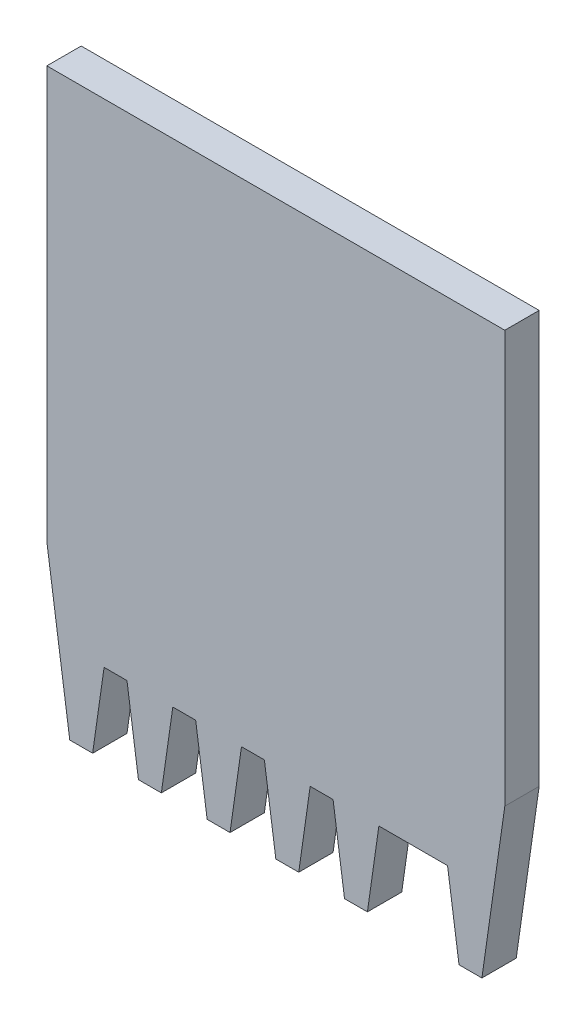
ISO-10303-21;
HEADER;
FILE_DESCRIPTION(('STEP AP214'),'2;1');
FILE_NAME('part.step','',(''),(''),'','','');
FILE_SCHEMA(('AUTOMOTIVE_DESIGN { 1 0 10303 214 1 1 1 1 }'));
ENDSEC;
DATA;
#1=APPLICATION_CONTEXT('core data for automotive mechanical design processes');
#2=APPLICATION_PROTOCOL_DEFINITION('international standard','automotive_design',2000,#1);
#3=PRODUCT_CONTEXT('',#1,'mechanical');
#4=PRODUCT('Part','Part','',(#3));
#5=PRODUCT_RELATED_PRODUCT_CATEGORY('part','',(#4));
#6=PRODUCT_DEFINITION_FORMATION('','',#4);
#7=PRODUCT_DEFINITION_CONTEXT('part definition',#1,'design');
#8=PRODUCT_DEFINITION('design','',#6,#7);
#9=PRODUCT_DEFINITION_SHAPE('','',#8);
#10=(LENGTH_UNIT() NAMED_UNIT(*) SI_UNIT(.MILLI.,.METRE.));
#11=(NAMED_UNIT(*) PLANE_ANGLE_UNIT() SI_UNIT($,.RADIAN.));
#12=(NAMED_UNIT(*) SI_UNIT($,.STERADIAN.) SOLID_ANGLE_UNIT());
#13=UNCERTAINTY_MEASURE_WITH_UNIT(LENGTH_MEASURE(1.E-05),#10,'distance_accuracy_value','');
#14=(GEOMETRIC_REPRESENTATION_CONTEXT(3) GLOBAL_UNCERTAINTY_ASSIGNED_CONTEXT((#13)) GLOBAL_UNIT_ASSIGNED_CONTEXT((#10,
#11,#12)) REPRESENTATION_CONTEXT('',''));
#15=CARTESIAN_POINT('',(0.,0.,0.));
#16=DIRECTION('',(0.,0.,1.));
#17=DIRECTION('',(1.,0.,0.));
#18=AXIS2_PLACEMENT_3D('',#15,#16,#17);
#19=CARTESIAN_POINT('',(0.,25.,1.5));
#20=DIRECTION('',(0.,-1.,0.));
#21=DIRECTION('',(1.,0.,0.));
#22=AXIS2_PLACEMENT_3D('',#19,#20,#21);
#23=PLANE('',#22);
#24=DIRECTION('',(-1.,0.,0.));
#25=VECTOR('',#24,1.);
#26=CARTESIAN_POINT('',(0.,25.,0.));
#27=LINE('',#26,#25);
#28=CARTESIAN_POINT('',(20.,25.,0.));
#29=VERTEX_POINT('',#28);
#30=CARTESIAN_POINT('',(0.,25.,0.));
#31=VERTEX_POINT('',#30);
#32=EDGE_CURVE('E239',#29,#31,#27,.T.);
#33=ORIENTED_EDGE('',*,*,#32,.T.);
#34=DIRECTION('',(0.,0.,-1.));
#35=VECTOR('',#34,1.);
#36=CARTESIAN_POINT('',(0.,25.,1.5));
#37=LINE('',#36,#35);
#38=CARTESIAN_POINT('',(0.,25.,1.5));
#39=VERTEX_POINT('',#38);
#40=EDGE_CURVE('E11',#39,#31,#37,.T.);
#41=ORIENTED_EDGE('',*,*,#40,.F.);
#42=DIRECTION('',(-1.,0.,0.));
#43=VECTOR('',#42,1.);
#44=CARTESIAN_POINT('',(0.,25.,1.5));
#45=LINE('',#44,#43);
#46=CARTESIAN_POINT('',(20.,25.,1.5));
#47=VERTEX_POINT('',#46);
#48=EDGE_CURVE('E289',#47,#39,#45,.T.);
#49=ORIENTED_EDGE('',*,*,#48,.F.);
#50=DIRECTION('',(0.,0.,-1.));
#51=VECTOR('',#50,1.);
#52=CARTESIAN_POINT('',(20.,25.,1.5));
#53=LINE('',#52,#51);
#54=EDGE_CURVE('E235',#47,#29,#53,.T.);
#55=ORIENTED_EDGE('',*,*,#54,.T.);
#56=EDGE_LOOP('',(#33,#41,#49,#55));
#57=FACE_BOUND('',#56,.T.);
#58=ADVANCED_FACE('F35',(#57),#23,.F.);
#59=CARTESIAN_POINT('',(0.,7.,1.5));
#60=DIRECTION('',(1.,0.,0.));
#61=DIRECTION('',(0.,0.,-1.));
#62=AXIS2_PLACEMENT_3D('',#59,#60,#61);
#63=PLANE('',#62);
#64=DIRECTION('',(0.,-1.,0.));
#65=VECTOR('',#64,1.);
#66=CARTESIAN_POINT('',(0.,7.,0.));
#67=LINE('',#66,#65);
#68=CARTESIAN_POINT('',(0.,7.,0.));
#69=VERTEX_POINT('',#68);
#70=EDGE_CURVE('E242',#31,#69,#67,.T.);
#71=ORIENTED_EDGE('',*,*,#70,.T.);
#72=DIRECTION('',(0.,0.,-1.));
#73=VECTOR('',#72,1.);
#74=CARTESIAN_POINT('',(0.,7.,1.5));
#75=LINE('',#74,#73);
#76=CARTESIAN_POINT('',(0.,7.,1.5));
#77=VERTEX_POINT('',#76);
#78=EDGE_CURVE('E43',#77,#69,#75,.T.);
#79=ORIENTED_EDGE('',*,*,#78,.F.);
#80=DIRECTION('',(0.,-1.,0.));
#81=VECTOR('',#80,1.);
#82=CARTESIAN_POINT('',(0.,7.,1.5));
#83=LINE('',#82,#81);
#84=EDGE_CURVE('E148',#39,#77,#83,.T.);
#85=ORIENTED_EDGE('',*,*,#84,.F.);
#86=ORIENTED_EDGE('',*,*,#40,.T.);
#87=EDGE_LOOP('',(#71,#79,#85,#86));
#88=FACE_BOUND('',#87,.T.);
#89=ADVANCED_FACE('F437',(#88),#63,.F.);
#90=CARTESIAN_POINT('',(0.,7.,1.5));
#91=DIRECTION('',(0.989949493661167,0.14142135623731,0.));
#92=DIRECTION('',(-0.14142135623731,0.989949493661167,0.));
#93=AXIS2_PLACEMENT_3D('',#90,#91,#92);
#94=PLANE('',#93);
#95=DIRECTION('',(0.14142135623731,-0.989949493661167,0.));
#96=VECTOR('',#95,1.);
#97=CARTESIAN_POINT('',(0.,7.,0.));
#98=LINE('',#97,#96);
#99=CARTESIAN_POINT('',(1.,0.,0.));
#100=VERTEX_POINT('',#99);
#101=EDGE_CURVE('E244',#69,#100,#98,.T.);
#102=ORIENTED_EDGE('',*,*,#101,.T.);
#103=DIRECTION('',(0.,0.,-1.));
#104=VECTOR('',#103,1.);
#105=CARTESIAN_POINT('',(1.,0.,1.5));
#106=LINE('',#105,#104);
#107=CARTESIAN_POINT('',(1.,0.,1.5));
#108=VERTEX_POINT('',#107);
#109=EDGE_CURVE('E350',#108,#100,#106,.T.);
#110=ORIENTED_EDGE('',*,*,#109,.F.);
#111=DIRECTION('',(0.14142135623731,-0.989949493661167,0.));
#112=VECTOR('',#111,1.);
#113=CARTESIAN_POINT('',(0.,7.,1.5));
#114=LINE('',#113,#112);
#115=EDGE_CURVE('E358',#77,#108,#114,.T.);
#116=ORIENTED_EDGE('',*,*,#115,.F.);
#117=ORIENTED_EDGE('',*,*,#78,.T.);
#118=EDGE_LOOP('',(#102,#110,#116,#117));
#119=FACE_BOUND('',#118,.T.);
#120=ADVANCED_FACE('F356',(#119),#94,.F.);
#121=CARTESIAN_POINT('',(1.,0.,1.5));
#122=DIRECTION('',(0.,1.,0.));
#123=DIRECTION('',(-1.,0.,0.));
#124=AXIS2_PLACEMENT_3D('',#121,#122,#123);
#125=PLANE('',#124);
#126=DIRECTION('',(1.,0.,0.));
#127=VECTOR('',#126,1.);
#128=CARTESIAN_POINT('',(1.,0.,0.));
#129=LINE('',#128,#127);
#130=CARTESIAN_POINT('',(2.,0.,0.));
#131=VERTEX_POINT('',#130);
#132=EDGE_CURVE('E246',#100,#131,#129,.T.);
#133=ORIENTED_EDGE('',*,*,#132,.T.);
#134=DIRECTION('',(0.,0.,-1.));
#135=VECTOR('',#134,1.);
#136=CARTESIAN_POINT('',(2.,0.,1.5));
#137=LINE('',#136,#135);
#138=CARTESIAN_POINT('',(2.,0.,1.5));
#139=VERTEX_POINT('',#138);
#140=EDGE_CURVE('E347',#139,#131,#137,.T.);
#141=ORIENTED_EDGE('',*,*,#140,.F.);
#142=DIRECTION('',(1.,0.,0.));
#143=VECTOR('',#142,1.);
#144=CARTESIAN_POINT('',(1.,0.,1.5));
#145=LINE('',#144,#143);
#146=EDGE_CURVE('E376',#108,#139,#145,.T.);
#147=ORIENTED_EDGE('',*,*,#146,.F.);
#148=ORIENTED_EDGE('',*,*,#109,.T.);
#149=EDGE_LOOP('',(#133,#141,#147,#148));
#150=FACE_BOUND('',#149,.T.);
#151=ADVANCED_FACE('F367',(#150),#125,.F.);
#152=CARTESIAN_POINT('',(2.,0.,1.5));
#153=DIRECTION('',(-0.989949493661166,0.14142135623731,0.));
#154=DIRECTION('',(-0.14142135623731,-0.989949493661167,0.));
#155=AXIS2_PLACEMENT_3D('',#152,#153,#154);
#156=PLANE('',#155);
#157=DIRECTION('',(0.14142135623731,0.989949493661167,0.));
#158=VECTOR('',#157,1.);
#159=CARTESIAN_POINT('',(2.,0.,0.));
#160=LINE('',#159,#158);
#161=CARTESIAN_POINT('',(2.5,3.5,0.));
#162=VERTEX_POINT('',#161);
#163=EDGE_CURVE('E248',#131,#162,#160,.T.);
#164=ORIENTED_EDGE('',*,*,#163,.T.);
#165=DIRECTION('',(0.,0.,-1.));
#166=VECTOR('',#165,1.);
#167=CARTESIAN_POINT('',(2.5,3.5,1.5));
#168=LINE('',#167,#166);
#169=CARTESIAN_POINT('',(2.5,3.5,1.5));
#170=VERTEX_POINT('',#169);
#171=EDGE_CURVE('E344',#170,#162,#168,.T.);
#172=ORIENTED_EDGE('',*,*,#171,.F.);
#173=DIRECTION('',(0.14142135623731,0.989949493661167,0.));
#174=VECTOR('',#173,1.);
#175=CARTESIAN_POINT('',(2.,0.,1.5));
#176=LINE('',#175,#174);
#177=EDGE_CURVE('E373',#139,#170,#176,.T.);
#178=ORIENTED_EDGE('',*,*,#177,.F.);
#179=ORIENTED_EDGE('',*,*,#140,.T.);
#180=EDGE_LOOP('',(#164,#172,#178,#179));
#181=FACE_BOUND('',#180,.T.);
#182=ADVANCED_FACE('F371',(#181),#156,.F.);
#183=CARTESIAN_POINT('',(2.5,3.5,1.5));
#184=DIRECTION('',(0.,1.,0.));
#185=DIRECTION('',(0.,0.,1.));
#186=AXIS2_PLACEMENT_3D('',#183,#184,#185);
#187=PLANE('',#186);
#188=DIRECTION('',(1.,0.,0.));
#189=VECTOR('',#188,1.);
#190=CARTESIAN_POINT('',(2.5,3.5,0.));
#191=LINE('',#190,#189);
#192=CARTESIAN_POINT('',(3.5,3.5,0.));
#193=VERTEX_POINT('',#192);
#194=EDGE_CURVE('E250',#162,#193,#191,.T.);
#195=ORIENTED_EDGE('',*,*,#194,.T.);
#196=DIRECTION('',(0.,0.,-1.));
#197=VECTOR('',#196,1.);
#198=CARTESIAN_POINT('',(3.5,3.5,1.5));
#199=LINE('',#198,#197);
#200=CARTESIAN_POINT('',(3.5,3.5,1.5));
#201=VERTEX_POINT('',#200);
#202=EDGE_CURVE('E341',#201,#193,#199,.T.);
#203=ORIENTED_EDGE('',*,*,#202,.F.);
#204=DIRECTION('',(1.,0.,0.));
#205=VECTOR('',#204,1.);
#206=CARTESIAN_POINT('',(2.5,3.5,1.5));
#207=LINE('',#206,#205);
#208=EDGE_CURVE('E375',#170,#201,#207,.T.);
#209=ORIENTED_EDGE('',*,*,#208,.F.);
#210=ORIENTED_EDGE('',*,*,#171,.T.);
#211=EDGE_LOOP('',(#195,#203,#209,#210));
#212=FACE_BOUND('',#211,.T.);
#213=ADVANCED_FACE('F450',(#212),#187,.F.);
#214=CARTESIAN_POINT('',(3.5,3.5,1.5));
#215=DIRECTION('',(0.989949493661167,0.14142135623731,0.));
#216=DIRECTION('',(-0.14142135623731,0.989949493661167,0.));
#217=AXIS2_PLACEMENT_3D('',#214,#215,#216);
#218=PLANE('',#217);
#219=DIRECTION('',(0.14142135623731,-0.989949493661167,0.));
#220=VECTOR('',#219,1.);
#221=CARTESIAN_POINT('',(3.5,3.5,0.));
#222=LINE('',#221,#220);
#223=CARTESIAN_POINT('',(4.,0.,0.));
#224=VERTEX_POINT('',#223);
#225=EDGE_CURVE('E252',#193,#224,#222,.T.);
#226=ORIENTED_EDGE('',*,*,#225,.T.);
#227=DIRECTION('',(0.,0.,-1.));
#228=VECTOR('',#227,1.);
#229=CARTESIAN_POINT('',(4.,0.,1.5));
#230=LINE('',#229,#228);
#231=CARTESIAN_POINT('',(4.,0.,1.5));
#232=VERTEX_POINT('',#231);
#233=EDGE_CURVE('E338',#232,#224,#230,.T.);
#234=ORIENTED_EDGE('',*,*,#233,.F.);
#235=DIRECTION('',(0.14142135623731,-0.989949493661167,0.));
#236=VECTOR('',#235,1.);
#237=CARTESIAN_POINT('',(3.5,3.5,1.5));
#238=LINE('',#237,#236);
#239=EDGE_CURVE('E378',#201,#232,#238,.T.);
#240=ORIENTED_EDGE('',*,*,#239,.F.);
#241=ORIENTED_EDGE('',*,*,#202,.T.);
#242=EDGE_LOOP('',(#226,#234,#240,#241));
#243=FACE_BOUND('',#242,.T.);
#244=ADVANCED_FACE('F453',(#243),#218,.F.);
#245=CARTESIAN_POINT('',(4.,0.,1.5));
#246=DIRECTION('',(0.,1.,0.));
#247=DIRECTION('',(-1.,0.,0.));
#248=AXIS2_PLACEMENT_3D('',#245,#246,#247);
#249=PLANE('',#248);
#250=DIRECTION('',(1.,0.,0.));
#251=VECTOR('',#250,1.);
#252=CARTESIAN_POINT('',(4.,0.,0.));
#253=LINE('',#252,#251);
#254=CARTESIAN_POINT('',(5.,0.,0.));
#255=VERTEX_POINT('',#254);
#256=EDGE_CURVE('E254',#224,#255,#253,.T.);
#257=ORIENTED_EDGE('',*,*,#256,.T.);
#258=DIRECTION('',(0.,0.,-1.));
#259=VECTOR('',#258,1.);
#260=CARTESIAN_POINT('',(5.,0.,1.5));
#261=LINE('',#260,#259);
#262=CARTESIAN_POINT('',(5.,0.,1.5));
#263=VERTEX_POINT('',#262);
#264=EDGE_CURVE('E335',#263,#255,#261,.T.);
#265=ORIENTED_EDGE('',*,*,#264,.F.);
#266=DIRECTION('',(1.,0.,0.));
#267=VECTOR('',#266,1.);
#268=CARTESIAN_POINT('',(4.,0.,1.5));
#269=LINE('',#268,#267);
#270=EDGE_CURVE('E384',#232,#263,#269,.T.);
#271=ORIENTED_EDGE('',*,*,#270,.F.);
#272=ORIENTED_EDGE('',*,*,#233,.T.);
#273=EDGE_LOOP('',(#257,#265,#271,#272));
#274=FACE_BOUND('',#273,.T.);
#275=ADVANCED_FACE('F457',(#274),#249,.F.);
#276=CARTESIAN_POINT('',(5.,0.,1.5));
#277=DIRECTION('',(-0.989949493661167,0.14142135623731,0.));
#278=DIRECTION('',(-0.14142135623731,-0.989949493661167,0.));
#279=AXIS2_PLACEMENT_3D('',#276,#277,#278);
#280=PLANE('',#279);
#281=DIRECTION('',(0.14142135623731,0.989949493661166,0.));
#282=VECTOR('',#281,1.);
#283=CARTESIAN_POINT('',(5.,0.,0.));
#284=LINE('',#283,#282);
#285=CARTESIAN_POINT('',(5.5,3.5,0.));
#286=VERTEX_POINT('',#285);
#287=EDGE_CURVE('E256',#255,#286,#284,.T.);
#288=ORIENTED_EDGE('',*,*,#287,.T.);
#289=DIRECTION('',(0.,0.,-1.));
#290=VECTOR('',#289,1.);
#291=CARTESIAN_POINT('',(5.5,3.5,1.5));
#292=LINE('',#291,#290);
#293=CARTESIAN_POINT('',(5.5,3.5,1.5));
#294=VERTEX_POINT('',#293);
#295=EDGE_CURVE('E332',#294,#286,#292,.T.);
#296=ORIENTED_EDGE('',*,*,#295,.F.);
#297=DIRECTION('',(0.14142135623731,0.989949493661166,0.));
#298=VECTOR('',#297,1.);
#299=CARTESIAN_POINT('',(5.,0.,1.5));
#300=LINE('',#299,#298);
#301=EDGE_CURVE('E386',#263,#294,#300,.T.);
#302=ORIENTED_EDGE('',*,*,#301,.F.);
#303=ORIENTED_EDGE('',*,*,#264,.T.);
#304=EDGE_LOOP('',(#288,#296,#302,#303));
#305=FACE_BOUND('',#304,.T.);
#306=ADVANCED_FACE('F461',(#305),#280,.F.);
#307=CARTESIAN_POINT('',(5.5,3.5,1.5));
#308=DIRECTION('',(0.,1.,0.));
#309=DIRECTION('',(0.,0.,1.));
#310=AXIS2_PLACEMENT_3D('',#307,#308,#309);
#311=PLANE('',#310);
#312=DIRECTION('',(1.,0.,0.));
#313=VECTOR('',#312,1.);
#314=CARTESIAN_POINT('',(5.5,3.5,0.));
#315=LINE('',#314,#313);
#316=CARTESIAN_POINT('',(6.5,3.5,0.));
#317=VERTEX_POINT('',#316);
#318=EDGE_CURVE('E258',#286,#317,#315,.T.);
#319=ORIENTED_EDGE('',*,*,#318,.T.);
#320=DIRECTION('',(0.,0.,-1.));
#321=VECTOR('',#320,1.);
#322=CARTESIAN_POINT('',(6.5,3.5,1.5));
#323=LINE('',#322,#321);
#324=CARTESIAN_POINT('',(6.5,3.5,1.5));
#325=VERTEX_POINT('',#324);
#326=EDGE_CURVE('E329',#325,#317,#323,.T.);
#327=ORIENTED_EDGE('',*,*,#326,.F.);
#328=DIRECTION('',(1.,0.,0.));
#329=VECTOR('',#328,1.);
#330=CARTESIAN_POINT('',(5.5,3.5,1.5));
#331=LINE('',#330,#329);
#332=EDGE_CURVE('E388',#294,#325,#331,.T.);
#333=ORIENTED_EDGE('',*,*,#332,.F.);
#334=ORIENTED_EDGE('',*,*,#295,.T.);
#335=EDGE_LOOP('',(#319,#327,#333,#334));
#336=FACE_BOUND('',#335,.T.);
#337=ADVANCED_FACE('F465',(#336),#311,.F.);
#338=CARTESIAN_POINT('',(6.5,3.5,1.5));
#339=DIRECTION('',(0.989949493661167,0.14142135623731,0.));
#340=DIRECTION('',(-0.14142135623731,0.989949493661167,0.));
#341=AXIS2_PLACEMENT_3D('',#338,#339,#340);
#342=PLANE('',#341);
#343=DIRECTION('',(0.14142135623731,-0.989949493661166,0.));
#344=VECTOR('',#343,1.);
#345=CARTESIAN_POINT('',(6.5,3.5,0.));
#346=LINE('',#345,#344);
#347=CARTESIAN_POINT('',(7.,0.,0.));
#348=VERTEX_POINT('',#347);
#349=EDGE_CURVE('E260',#317,#348,#346,.T.);
#350=ORIENTED_EDGE('',*,*,#349,.T.);
#351=DIRECTION('',(0.,0.,-1.));
#352=VECTOR('',#351,1.);
#353=CARTESIAN_POINT('',(7.,0.,1.5));
#354=LINE('',#353,#352);
#355=CARTESIAN_POINT('',(7.,0.,1.5));
#356=VERTEX_POINT('',#355);
#357=EDGE_CURVE('E326',#356,#348,#354,.T.);
#358=ORIENTED_EDGE('',*,*,#357,.F.);
#359=DIRECTION('',(0.14142135623731,-0.989949493661166,0.));
#360=VECTOR('',#359,1.);
#361=CARTESIAN_POINT('',(6.5,3.5,1.5));
#362=LINE('',#361,#360);
#363=EDGE_CURVE('E390',#325,#356,#362,.T.);
#364=ORIENTED_EDGE('',*,*,#363,.F.);
#365=ORIENTED_EDGE('',*,*,#326,.T.);
#366=EDGE_LOOP('',(#350,#358,#364,#365));
#367=FACE_BOUND('',#366,.T.);
#368=ADVANCED_FACE('F469',(#367),#342,.F.);
#369=CARTESIAN_POINT('',(7.,0.,1.5));
#370=DIRECTION('',(0.,1.,0.));
#371=DIRECTION('',(-1.,0.,0.));
#372=AXIS2_PLACEMENT_3D('',#369,#370,#371);
#373=PLANE('',#372);
#374=DIRECTION('',(1.,0.,0.));
#375=VECTOR('',#374,1.);
#376=CARTESIAN_POINT('',(7.,0.,0.));
#377=LINE('',#376,#375);
#378=CARTESIAN_POINT('',(8.,0.,0.));
#379=VERTEX_POINT('',#378);
#380=EDGE_CURVE('E262',#348,#379,#377,.T.);
#381=ORIENTED_EDGE('',*,*,#380,.T.);
#382=DIRECTION('',(0.,0.,-1.));
#383=VECTOR('',#382,1.);
#384=CARTESIAN_POINT('',(8.,0.,1.5));
#385=LINE('',#384,#383);
#386=CARTESIAN_POINT('',(8.,0.,1.5));
#387=VERTEX_POINT('',#386);
#388=EDGE_CURVE('E323',#387,#379,#385,.T.);
#389=ORIENTED_EDGE('',*,*,#388,.F.);
#390=DIRECTION('',(1.,0.,0.));
#391=VECTOR('',#390,1.);
#392=CARTESIAN_POINT('',(7.,0.,1.5));
#393=LINE('',#392,#391);
#394=EDGE_CURVE('E392',#356,#387,#393,.T.);
#395=ORIENTED_EDGE('',*,*,#394,.F.);
#396=ORIENTED_EDGE('',*,*,#357,.T.);
#397=EDGE_LOOP('',(#381,#389,#395,#396));
#398=FACE_BOUND('',#397,.T.);
#399=ADVANCED_FACE('F473',(#398),#373,.F.);
#400=CARTESIAN_POINT('',(8.,0.,1.5));
#401=DIRECTION('',(-0.989949493661166,0.14142135623731,0.));
#402=DIRECTION('',(-0.14142135623731,-0.989949493661167,0.));
#403=AXIS2_PLACEMENT_3D('',#400,#401,#402);
#404=PLANE('',#403);
#405=DIRECTION('',(0.14142135623731,0.989949493661166,0.));
#406=VECTOR('',#405,1.);
#407=CARTESIAN_POINT('',(8.,0.,0.));
#408=LINE('',#407,#406);
#409=CARTESIAN_POINT('',(8.5,3.5,0.));
#410=VERTEX_POINT('',#409);
#411=EDGE_CURVE('E264',#379,#410,#408,.T.);
#412=ORIENTED_EDGE('',*,*,#411,.T.);
#413=DIRECTION('',(0.,0.,-1.));
#414=VECTOR('',#413,1.);
#415=CARTESIAN_POINT('',(8.5,3.5,1.5));
#416=LINE('',#415,#414);
#417=CARTESIAN_POINT('',(8.5,3.5,1.5));
#418=VERTEX_POINT('',#417);
#419=EDGE_CURVE('E320',#418,#410,#416,.T.);
#420=ORIENTED_EDGE('',*,*,#419,.F.);
#421=DIRECTION('',(0.14142135623731,0.989949493661166,0.));
#422=VECTOR('',#421,1.);
#423=CARTESIAN_POINT('',(8.,0.,1.5));
#424=LINE('',#423,#422);
#425=EDGE_CURVE('E394',#387,#418,#424,.T.);
#426=ORIENTED_EDGE('',*,*,#425,.F.);
#427=ORIENTED_EDGE('',*,*,#388,.T.);
#428=EDGE_LOOP('',(#412,#420,#426,#427));
#429=FACE_BOUND('',#428,.T.);
#430=ADVANCED_FACE('F477',(#429),#404,.F.);
#431=CARTESIAN_POINT('',(8.5,3.5,1.5));
#432=DIRECTION('',(0.,1.,0.));
#433=DIRECTION('',(0.,0.,1.));
#434=AXIS2_PLACEMENT_3D('',#431,#432,#433);
#435=PLANE('',#434);
#436=DIRECTION('',(1.,0.,0.));
#437=VECTOR('',#436,1.);
#438=CARTESIAN_POINT('',(8.5,3.5,0.));
#439=LINE('',#438,#437);
#440=CARTESIAN_POINT('',(9.5,3.5,0.));
#441=VERTEX_POINT('',#440);
#442=EDGE_CURVE('E266',#410,#441,#439,.T.);
#443=ORIENTED_EDGE('',*,*,#442,.T.);
#444=DIRECTION('',(0.,0.,-1.));
#445=VECTOR('',#444,1.);
#446=CARTESIAN_POINT('',(9.5,3.5,1.5));
#447=LINE('',#446,#445);
#448=CARTESIAN_POINT('',(9.5,3.5,1.5));
#449=VERTEX_POINT('',#448);
#450=EDGE_CURVE('E317',#449,#441,#447,.T.);
#451=ORIENTED_EDGE('',*,*,#450,.F.);
#452=DIRECTION('',(1.,0.,0.));
#453=VECTOR('',#452,1.);
#454=CARTESIAN_POINT('',(8.5,3.5,1.5));
#455=LINE('',#454,#453);
#456=EDGE_CURVE('E396',#418,#449,#455,.T.);
#457=ORIENTED_EDGE('',*,*,#456,.F.);
#458=ORIENTED_EDGE('',*,*,#419,.T.);
#459=EDGE_LOOP('',(#443,#451,#457,#458));
#460=FACE_BOUND('',#459,.T.);
#461=ADVANCED_FACE('F481',(#460),#435,.F.);
#462=CARTESIAN_POINT('',(9.5,3.5,1.5));
#463=DIRECTION('',(0.989949493661167,0.14142135623731,0.));
#464=DIRECTION('',(-0.14142135623731,0.989949493661167,0.));
#465=AXIS2_PLACEMENT_3D('',#462,#463,#464);
#466=PLANE('',#465);
#467=DIRECTION('',(0.14142135623731,-0.989949493661166,0.));
#468=VECTOR('',#467,1.);
#469=CARTESIAN_POINT('',(9.5,3.5,0.));
#470=LINE('',#469,#468);
#471=CARTESIAN_POINT('',(10.,0.,0.));
#472=VERTEX_POINT('',#471);
#473=EDGE_CURVE('E268',#441,#472,#470,.T.);
#474=ORIENTED_EDGE('',*,*,#473,.T.);
#475=DIRECTION('',(0.,0.,-1.));
#476=VECTOR('',#475,1.);
#477=CARTESIAN_POINT('',(10.,0.,1.5));
#478=LINE('',#477,#476);
#479=CARTESIAN_POINT('',(10.,0.,1.5));
#480=VERTEX_POINT('',#479);
#481=EDGE_CURVE('E314',#480,#472,#478,.T.);
#482=ORIENTED_EDGE('',*,*,#481,.F.);
#483=DIRECTION('',(0.14142135623731,-0.989949493661166,0.));
#484=VECTOR('',#483,1.);
#485=CARTESIAN_POINT('',(9.5,3.5,1.5));
#486=LINE('',#485,#484);
#487=EDGE_CURVE('E398',#449,#480,#486,.T.);
#488=ORIENTED_EDGE('',*,*,#487,.F.);
#489=ORIENTED_EDGE('',*,*,#450,.T.);
#490=EDGE_LOOP('',(#474,#482,#488,#489));
#491=FACE_BOUND('',#490,.T.);
#492=ADVANCED_FACE('F485',(#491),#466,.F.);
#493=CARTESIAN_POINT('',(10.,0.,1.5));
#494=DIRECTION('',(0.,1.,0.));
#495=DIRECTION('',(-1.,0.,0.));
#496=AXIS2_PLACEMENT_3D('',#493,#494,#495);
#497=PLANE('',#496);
#498=DIRECTION('',(1.,0.,0.));
#499=VECTOR('',#498,1.);
#500=CARTESIAN_POINT('',(10.,0.,0.));
#501=LINE('',#500,#499);
#502=CARTESIAN_POINT('',(11.,0.,0.));
#503=VERTEX_POINT('',#502);
#504=EDGE_CURVE('E270',#472,#503,#501,.T.);
#505=ORIENTED_EDGE('',*,*,#504,.T.);
#506=DIRECTION('',(0.,0.,-1.));
#507=VECTOR('',#506,1.);
#508=CARTESIAN_POINT('',(11.,0.,1.5));
#509=LINE('',#508,#507);
#510=CARTESIAN_POINT('',(11.,0.,1.5));
#511=VERTEX_POINT('',#510);
#512=EDGE_CURVE('E311',#511,#503,#509,.T.);
#513=ORIENTED_EDGE('',*,*,#512,.F.);
#514=DIRECTION('',(1.,0.,0.));
#515=VECTOR('',#514,1.);
#516=CARTESIAN_POINT('',(10.,0.,1.5));
#517=LINE('',#516,#515);
#518=EDGE_CURVE('E400',#480,#511,#517,.T.);
#519=ORIENTED_EDGE('',*,*,#518,.F.);
#520=ORIENTED_EDGE('',*,*,#481,.T.);
#521=EDGE_LOOP('',(#505,#513,#519,#520));
#522=FACE_BOUND('',#521,.T.);
#523=ADVANCED_FACE('F489',(#522),#497,.F.);
#524=CARTESIAN_POINT('',(11.,0.,1.5));
#525=DIRECTION('',(-0.989949493661166,0.14142135623731,0.));
#526=DIRECTION('',(-0.14142135623731,-0.989949493661167,0.));
#527=AXIS2_PLACEMENT_3D('',#524,#525,#526);
#528=PLANE('',#527);
#529=DIRECTION('',(0.14142135623731,0.989949493661166,0.));
#530=VECTOR('',#529,1.);
#531=CARTESIAN_POINT('',(11.,0.,0.));
#532=LINE('',#531,#530);
#533=CARTESIAN_POINT('',(11.5,3.5,0.));
#534=VERTEX_POINT('',#533);
#535=EDGE_CURVE('E272',#503,#534,#532,.T.);
#536=ORIENTED_EDGE('',*,*,#535,.T.);
#537=DIRECTION('',(0.,0.,-1.));
#538=VECTOR('',#537,1.);
#539=CARTESIAN_POINT('',(11.5,3.5,1.5));
#540=LINE('',#539,#538);
#541=CARTESIAN_POINT('',(11.5,3.5,1.5));
#542=VERTEX_POINT('',#541);
#543=EDGE_CURVE('E308',#542,#534,#540,.T.);
#544=ORIENTED_EDGE('',*,*,#543,.F.);
#545=DIRECTION('',(0.14142135623731,0.989949493661166,0.));
#546=VECTOR('',#545,1.);
#547=CARTESIAN_POINT('',(11.,0.,1.5));
#548=LINE('',#547,#546);
#549=EDGE_CURVE('E402',#511,#542,#548,.T.);
#550=ORIENTED_EDGE('',*,*,#549,.F.);
#551=ORIENTED_EDGE('',*,*,#512,.T.);
#552=EDGE_LOOP('',(#536,#544,#550,#551));
#553=FACE_BOUND('',#552,.T.);
#554=ADVANCED_FACE('F493',(#553),#528,.F.);
#555=CARTESIAN_POINT('',(11.5,3.5,1.5));
#556=DIRECTION('',(0.,1.,0.));
#557=DIRECTION('',(0.,0.,1.));
#558=AXIS2_PLACEMENT_3D('',#555,#556,#557);
#559=PLANE('',#558);
#560=DIRECTION('',(1.,0.,0.));
#561=VECTOR('',#560,1.);
#562=CARTESIAN_POINT('',(11.5,3.5,0.));
#563=LINE('',#562,#561);
#564=CARTESIAN_POINT('',(12.5,3.5,0.));
#565=VERTEX_POINT('',#564);
#566=EDGE_CURVE('E274',#534,#565,#563,.T.);
#567=ORIENTED_EDGE('',*,*,#566,.T.);
#568=DIRECTION('',(0.,0.,-1.));
#569=VECTOR('',#568,1.);
#570=CARTESIAN_POINT('',(12.5,3.5,1.5));
#571=LINE('',#570,#569);
#572=CARTESIAN_POINT('',(12.5,3.5,1.5));
#573=VERTEX_POINT('',#572);
#574=EDGE_CURVE('E305',#573,#565,#571,.T.);
#575=ORIENTED_EDGE('',*,*,#574,.F.);
#576=DIRECTION('',(1.,0.,0.));
#577=VECTOR('',#576,1.);
#578=CARTESIAN_POINT('',(11.5,3.5,1.5));
#579=LINE('',#578,#577);
#580=EDGE_CURVE('E404',#542,#573,#579,.T.);
#581=ORIENTED_EDGE('',*,*,#580,.F.);
#582=ORIENTED_EDGE('',*,*,#543,.T.);
#583=EDGE_LOOP('',(#567,#575,#581,#582));
#584=FACE_BOUND('',#583,.T.);
#585=ADVANCED_FACE('F497',(#584),#559,.F.);
#586=CARTESIAN_POINT('',(12.5,3.5,1.5));
#587=DIRECTION('',(0.989949493661166,0.14142135623731,0.));
#588=DIRECTION('',(-0.14142135623731,0.989949493661167,0.));
#589=AXIS2_PLACEMENT_3D('',#586,#587,#588);
#590=PLANE('',#589);
#591=DIRECTION('',(0.14142135623731,-0.989949493661166,0.));
#592=VECTOR('',#591,1.);
#593=CARTESIAN_POINT('',(12.5,3.5,0.));
#594=LINE('',#593,#592);
#595=CARTESIAN_POINT('',(13.,0.,0.));
#596=VERTEX_POINT('',#595);
#597=EDGE_CURVE('E276',#565,#596,#594,.T.);
#598=ORIENTED_EDGE('',*,*,#597,.T.);
#599=DIRECTION('',(0.,0.,-1.));
#600=VECTOR('',#599,1.);
#601=CARTESIAN_POINT('',(13.,0.,1.5));
#602=LINE('',#601,#600);
#603=CARTESIAN_POINT('',(13.,0.,1.5));
#604=VERTEX_POINT('',#603);
#605=EDGE_CURVE('E302',#604,#596,#602,.T.);
#606=ORIENTED_EDGE('',*,*,#605,.F.);
#607=DIRECTION('',(0.14142135623731,-0.989949493661166,0.));
#608=VECTOR('',#607,1.);
#609=CARTESIAN_POINT('',(12.5,3.5,1.5));
#610=LINE('',#609,#608);
#611=EDGE_CURVE('E406',#573,#604,#610,.T.);
#612=ORIENTED_EDGE('',*,*,#611,.F.);
#613=ORIENTED_EDGE('',*,*,#574,.T.);
#614=EDGE_LOOP('',(#598,#606,#612,#613));
#615=FACE_BOUND('',#614,.T.);
#616=ADVANCED_FACE('F501',(#615),#590,.F.);
#617=CARTESIAN_POINT('',(13.,0.,1.5));
#618=DIRECTION('',(0.,1.,0.));
#619=DIRECTION('',(-1.,0.,0.));
#620=AXIS2_PLACEMENT_3D('',#617,#618,#619);
#621=PLANE('',#620);
#622=DIRECTION('',(1.,0.,0.));
#623=VECTOR('',#622,1.);
#624=CARTESIAN_POINT('',(13.,0.,0.));
#625=LINE('',#624,#623);
#626=CARTESIAN_POINT('',(14.,0.,0.));
#627=VERTEX_POINT('',#626);
#628=EDGE_CURVE('E278',#596,#627,#625,.T.);
#629=ORIENTED_EDGE('',*,*,#628,.T.);
#630=DIRECTION('',(0.,0.,-1.));
#631=VECTOR('',#630,1.);
#632=CARTESIAN_POINT('',(14.,0.,1.5));
#633=LINE('',#632,#631);
#634=CARTESIAN_POINT('',(14.,0.,1.5));
#635=VERTEX_POINT('',#634);
#636=EDGE_CURVE('E299',#635,#627,#633,.T.);
#637=ORIENTED_EDGE('',*,*,#636,.F.);
#638=DIRECTION('',(1.,0.,0.));
#639=VECTOR('',#638,1.);
#640=CARTESIAN_POINT('',(13.,0.,1.5));
#641=LINE('',#640,#639);
#642=EDGE_CURVE('E408',#604,#635,#641,.T.);
#643=ORIENTED_EDGE('',*,*,#642,.F.);
#644=ORIENTED_EDGE('',*,*,#605,.T.);
#645=EDGE_LOOP('',(#629,#637,#643,#644));
#646=FACE_BOUND('',#645,.T.);
#647=ADVANCED_FACE('F505',(#646),#621,.F.);
#648=CARTESIAN_POINT('',(14.,0.,1.5));
#649=DIRECTION('',(-0.989949493661167,0.14142135623731,0.));
#650=DIRECTION('',(-0.14142135623731,-0.989949493661167,0.));
#651=AXIS2_PLACEMENT_3D('',#648,#649,#650);
#652=PLANE('',#651);
#653=DIRECTION('',(0.14142135623731,0.989949493661166,0.));
#654=VECTOR('',#653,1.);
#655=CARTESIAN_POINT('',(14.,0.,0.));
#656=LINE('',#655,#654);
#657=CARTESIAN_POINT('',(14.5,3.5,0.));
#658=VERTEX_POINT('',#657);
#659=EDGE_CURVE('E280',#627,#658,#656,.T.);
#660=ORIENTED_EDGE('',*,*,#659,.T.);
#661=DIRECTION('',(0.,0.,-1.));
#662=VECTOR('',#661,1.);
#663=CARTESIAN_POINT('',(14.5,3.5,1.5));
#664=LINE('',#663,#662);
#665=CARTESIAN_POINT('',(14.5,3.5,1.5));
#666=VERTEX_POINT('',#665);
#667=EDGE_CURVE('E296',#666,#658,#664,.T.);
#668=ORIENTED_EDGE('',*,*,#667,.F.);
#669=DIRECTION('',(0.14142135623731,0.989949493661166,0.));
#670=VECTOR('',#669,1.);
#671=CARTESIAN_POINT('',(14.,0.,1.5));
#672=LINE('',#671,#670);
#673=EDGE_CURVE('E410',#635,#666,#672,.T.);
#674=ORIENTED_EDGE('',*,*,#673,.F.);
#675=ORIENTED_EDGE('',*,*,#636,.T.);
#676=EDGE_LOOP('',(#660,#668,#674,#675));
#677=FACE_BOUND('',#676,.T.);
#678=ADVANCED_FACE('F509',(#677),#652,.F.);
#679=CARTESIAN_POINT('',(14.5,3.5,1.5));
#680=DIRECTION('',(0.,1.,0.));
#681=DIRECTION('',(0.,0.,1.));
#682=AXIS2_PLACEMENT_3D('',#679,#680,#681);
#683=PLANE('',#682);
#684=DIRECTION('',(1.,0.,0.));
#685=VECTOR('',#684,1.);
#686=CARTESIAN_POINT('',(14.5,3.5,0.));
#687=LINE('',#686,#685);
#688=CARTESIAN_POINT('',(17.5,3.5,0.));
#689=VERTEX_POINT('',#688);
#690=EDGE_CURVE('E282',#658,#689,#687,.T.);
#691=ORIENTED_EDGE('',*,*,#690,.T.);
#692=DIRECTION('',(0.,0.,-1.));
#693=VECTOR('',#692,1.);
#694=CARTESIAN_POINT('',(17.5,3.5,1.5));
#695=LINE('',#694,#693);
#696=CARTESIAN_POINT('',(17.5,3.5,1.5));
#697=VERTEX_POINT('',#696);
#698=EDGE_CURVE('E293',#697,#689,#695,.T.);
#699=ORIENTED_EDGE('',*,*,#698,.F.);
#700=DIRECTION('',(1.,0.,0.));
#701=VECTOR('',#700,1.);
#702=CARTESIAN_POINT('',(14.5,3.5,1.5));
#703=LINE('',#702,#701);
#704=EDGE_CURVE('E412',#666,#697,#703,.T.);
#705=ORIENTED_EDGE('',*,*,#704,.F.);
#706=ORIENTED_EDGE('',*,*,#667,.T.);
#707=EDGE_LOOP('',(#691,#699,#705,#706));
#708=FACE_BOUND('',#707,.T.);
#709=ADVANCED_FACE('F418',(#708),#683,.F.);
#710=CARTESIAN_POINT('',(17.5,3.5,1.5));
#711=DIRECTION('',(0.989949493661166,0.14142135623731,0.));
#712=DIRECTION('',(-0.141421356237311,0.989949493661167,0.));
#713=AXIS2_PLACEMENT_3D('',#710,#711,#712);
#714=PLANE('',#713);
#715=DIRECTION('',(0.14142135623731,-0.989949493661166,0.));
#716=VECTOR('',#715,1.);
#717=CARTESIAN_POINT('',(17.5,3.5,0.));
#718=LINE('',#717,#716);
#719=CARTESIAN_POINT('',(18.,0.,0.));
#720=VERTEX_POINT('',#719);
#721=EDGE_CURVE('E284',#689,#720,#718,.T.);
#722=ORIENTED_EDGE('',*,*,#721,.T.);
#723=DIRECTION('',(0.,0.,-1.));
#724=VECTOR('',#723,1.);
#725=CARTESIAN_POINT('',(18.,0.,1.5));
#726=LINE('',#725,#724);
#727=CARTESIAN_POINT('',(18.,0.,1.5));
#728=VERTEX_POINT('',#727);
#729=EDGE_CURVE('E230',#728,#720,#726,.T.);
#730=ORIENTED_EDGE('',*,*,#729,.F.);
#731=DIRECTION('',(0.14142135623731,-0.989949493661166,0.));
#732=VECTOR('',#731,1.);
#733=CARTESIAN_POINT('',(17.5,3.5,1.5));
#734=LINE('',#733,#732);
#735=EDGE_CURVE('E221',#697,#728,#734,.T.);
#736=ORIENTED_EDGE('',*,*,#735,.F.);
#737=ORIENTED_EDGE('',*,*,#698,.T.);
#738=EDGE_LOOP('',(#722,#730,#736,#737));
#739=FACE_BOUND('',#738,.T.);
#740=ADVANCED_FACE('F422',(#739),#714,.F.);
#741=CARTESIAN_POINT('',(18.,0.,1.5));
#742=DIRECTION('',(0.,1.,0.));
#743=DIRECTION('',(-1.,0.,0.));
#744=AXIS2_PLACEMENT_3D('',#741,#742,#743);
#745=PLANE('',#744);
#746=DIRECTION('',(1.,0.,0.));
#747=VECTOR('',#746,1.);
#748=CARTESIAN_POINT('',(18.,0.,0.));
#749=LINE('',#748,#747);
#750=CARTESIAN_POINT('',(19.,0.,0.));
#751=VERTEX_POINT('',#750);
#752=EDGE_CURVE('E229',#720,#751,#749,.T.);
#753=ORIENTED_EDGE('',*,*,#752,.T.);
#754=DIRECTION('',(0.,0.,-1.));
#755=VECTOR('',#754,1.);
#756=CARTESIAN_POINT('',(19.,0.,1.5));
#757=LINE('',#756,#755);
#758=CARTESIAN_POINT('',(19.,0.,1.5));
#759=VERTEX_POINT('',#758);
#760=EDGE_CURVE('E226',#759,#751,#757,.T.);
#761=ORIENTED_EDGE('',*,*,#760,.F.);
#762=DIRECTION('',(1.,0.,0.));
#763=VECTOR('',#762,1.);
#764=CARTESIAN_POINT('',(18.,0.,1.5));
#765=LINE('',#764,#763);
#766=EDGE_CURVE('E215',#728,#759,#765,.T.);
#767=ORIENTED_EDGE('',*,*,#766,.F.);
#768=ORIENTED_EDGE('',*,*,#729,.T.);
#769=EDGE_LOOP('',(#753,#761,#767,#768));
#770=FACE_BOUND('',#769,.T.);
#771=ADVANCED_FACE('F227',(#770),#745,.F.);
#772=CARTESIAN_POINT('',(19.,0.,1.5));
#773=DIRECTION('',(-0.989949493661166,0.14142135623731,0.));
#774=DIRECTION('',(-0.14142135623731,-0.989949493661167,0.));
#775=AXIS2_PLACEMENT_3D('',#772,#773,#774);
#776=PLANE('',#775);
#777=DIRECTION('',(0.14142135623731,0.989949493661166,0.));
#778=VECTOR('',#777,1.);
#779=CARTESIAN_POINT('',(19.,0.,0.));
#780=LINE('',#779,#778);
#781=CARTESIAN_POINT('',(20.,6.99999999999996,0.));
#782=VERTEX_POINT('',#781);
#783=EDGE_CURVE('E134',#751,#782,#780,.T.);
#784=ORIENTED_EDGE('',*,*,#783,.T.);
#785=DIRECTION('',(0.,0.,-1.));
#786=VECTOR('',#785,1.);
#787=CARTESIAN_POINT('',(20.,6.99999999999996,1.5));
#788=LINE('',#787,#786);
#789=CARTESIAN_POINT('',(20.,6.99999999999996,1.5));
#790=VERTEX_POINT('',#789);
#791=EDGE_CURVE('E231',#790,#782,#788,.T.);
#792=ORIENTED_EDGE('',*,*,#791,.F.);
#793=DIRECTION('',(0.14142135623731,0.989949493661166,0.));
#794=VECTOR('',#793,1.);
#795=CARTESIAN_POINT('',(19.,0.,1.5));
#796=LINE('',#795,#794);
#797=EDGE_CURVE('E219',#759,#790,#796,.T.);
#798=ORIENTED_EDGE('',*,*,#797,.F.);
#799=ORIENTED_EDGE('',*,*,#760,.T.);
#800=EDGE_LOOP('',(#784,#792,#798,#799));
#801=FACE_BOUND('',#800,.T.);
#802=ADVANCED_FACE('F233',(#801),#776,.F.);
#803=CARTESIAN_POINT('',(20.,25.,1.5));
#804=DIRECTION('',(-1.,0.,0.));
#805=DIRECTION('',(0.,-1.,0.));
#806=AXIS2_PLACEMENT_3D('',#803,#804,#805);
#807=PLANE('',#806);
#808=DIRECTION('',(0.,1.,0.));
#809=VECTOR('',#808,1.);
#810=CARTESIAN_POINT('',(20.,25.,0.));
#811=LINE('',#810,#809);
#812=EDGE_CURVE('E140',#782,#29,#811,.T.);
#813=ORIENTED_EDGE('',*,*,#812,.T.);
#814=ORIENTED_EDGE('',*,*,#54,.F.);
#815=DIRECTION('',(0.,1.,0.));
#816=VECTOR('',#815,1.);
#817=CARTESIAN_POINT('',(20.,25.,1.5));
#818=LINE('',#817,#816);
#819=EDGE_CURVE('E51',#790,#47,#818,.T.);
#820=ORIENTED_EDGE('',*,*,#819,.F.);
#821=ORIENTED_EDGE('',*,*,#791,.T.);
#822=EDGE_LOOP('',(#813,#814,#820,#821));
#823=FACE_BOUND('',#822,.T.);
#824=ADVANCED_FACE('F426',(#823),#807,.F.);
#825=CARTESIAN_POINT('',(0.,0.,1.5));
#826=DIRECTION('',(0.,0.,-1.));
#827=DIRECTION('',(-1.,0.,0.));
#828=AXIS2_PLACEMENT_3D('',#825,#826,#827);
#829=PLANE('',#828);
#830=ORIENTED_EDGE('',*,*,#48,.T.);
#831=ORIENTED_EDGE('',*,*,#84,.T.);
#832=ORIENTED_EDGE('',*,*,#115,.T.);
#833=ORIENTED_EDGE('',*,*,#146,.T.);
#834=ORIENTED_EDGE('',*,*,#177,.T.);
#835=ORIENTED_EDGE('',*,*,#208,.T.);
#836=ORIENTED_EDGE('',*,*,#239,.T.);
#837=ORIENTED_EDGE('',*,*,#270,.T.);
#838=ORIENTED_EDGE('',*,*,#301,.T.);
#839=ORIENTED_EDGE('',*,*,#332,.T.);
#840=ORIENTED_EDGE('',*,*,#363,.T.);
#841=ORIENTED_EDGE('',*,*,#394,.T.);
#842=ORIENTED_EDGE('',*,*,#425,.T.);
#843=ORIENTED_EDGE('',*,*,#456,.T.);
#844=ORIENTED_EDGE('',*,*,#487,.T.);
#845=ORIENTED_EDGE('',*,*,#518,.T.);
#846=ORIENTED_EDGE('',*,*,#549,.T.);
#847=ORIENTED_EDGE('',*,*,#580,.T.);
#848=ORIENTED_EDGE('',*,*,#611,.T.);
#849=ORIENTED_EDGE('',*,*,#642,.T.);
#850=ORIENTED_EDGE('',*,*,#673,.T.);
#851=ORIENTED_EDGE('',*,*,#704,.T.);
#852=ORIENTED_EDGE('',*,*,#735,.T.);
#853=ORIENTED_EDGE('',*,*,#766,.T.);
#854=ORIENTED_EDGE('',*,*,#797,.T.);
#855=ORIENTED_EDGE('',*,*,#819,.T.);
#856=EDGE_LOOP('',(#830,#831,#832,#833,#834,#835,#836,#837,#838,#839,#840,#841,#842,#843,#844,
#845,#846,#847,#848,#849,#850,#851,#852,#853,#854,#855));
#857=FACE_BOUND('',#856,.T.);
#858=ADVANCED_FACE('F217',(#857),#829,.F.);
#859=CARTESIAN_POINT('',(0.,0.,0.));
#860=DIRECTION('',(0.,0.,-1.));
#861=DIRECTION('',(-1.,0.,0.));
#862=AXIS2_PLACEMENT_3D('',#859,#860,#861);
#863=PLANE('',#862);
#864=ORIENTED_EDGE('',*,*,#32,.F.);
#865=ORIENTED_EDGE('',*,*,#812,.F.);
#866=ORIENTED_EDGE('',*,*,#783,.F.);
#867=ORIENTED_EDGE('',*,*,#752,.F.);
#868=ORIENTED_EDGE('',*,*,#721,.F.);
#869=ORIENTED_EDGE('',*,*,#690,.F.);
#870=ORIENTED_EDGE('',*,*,#659,.F.);
#871=ORIENTED_EDGE('',*,*,#628,.F.);
#872=ORIENTED_EDGE('',*,*,#597,.F.);
#873=ORIENTED_EDGE('',*,*,#566,.F.);
#874=ORIENTED_EDGE('',*,*,#535,.F.);
#875=ORIENTED_EDGE('',*,*,#504,.F.);
#876=ORIENTED_EDGE('',*,*,#473,.F.);
#877=ORIENTED_EDGE('',*,*,#442,.F.);
#878=ORIENTED_EDGE('',*,*,#411,.F.);
#879=ORIENTED_EDGE('',*,*,#380,.F.);
#880=ORIENTED_EDGE('',*,*,#349,.F.);
#881=ORIENTED_EDGE('',*,*,#318,.F.);
#882=ORIENTED_EDGE('',*,*,#287,.F.);
#883=ORIENTED_EDGE('',*,*,#256,.F.);
#884=ORIENTED_EDGE('',*,*,#225,.F.);
#885=ORIENTED_EDGE('',*,*,#194,.F.);
#886=ORIENTED_EDGE('',*,*,#163,.F.);
#887=ORIENTED_EDGE('',*,*,#132,.F.);
#888=ORIENTED_EDGE('',*,*,#101,.F.);
#889=ORIENTED_EDGE('',*,*,#70,.F.);
#890=EDGE_LOOP('',(#864,#865,#866,#867,#868,#869,#870,#871,#872,#873,#874,#875,#876,#877,#878,
#879,#880,#881,#882,#883,#884,#885,#886,#887,#888,#889));
#891=FACE_BOUND('',#890,.T.);
#892=ADVANCED_FACE('F362',(#891),#863,.T.);
#893=CLOSED_SHELL('',(#58,#89,#120,#151,#182,#213,#244,#275,#306,#337,#368,#399,#430,#461,#492,
#523,#554,#585,#616,#647,#678,#709,#740,#771,#802,#824,#858,#892));
#894=MANIFOLD_SOLID_BREP('B2',#893);
#895=ADVANCED_BREP_SHAPE_REPRESENTATION('',(#18,#894),#14);
#896=SHAPE_DEFINITION_REPRESENTATION(#9,#895);
ENDSEC;
END-ISO-10303-21;
